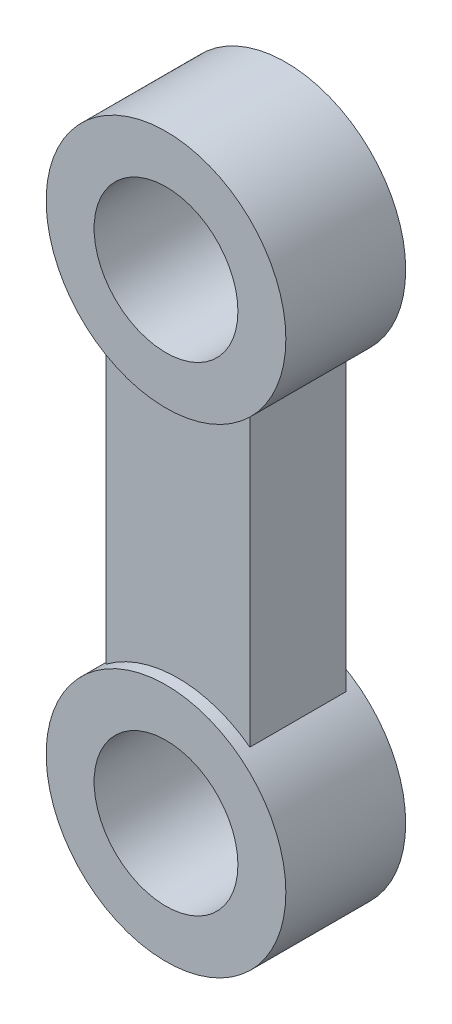
ISO-10303-21;
HEADER;
FILE_DESCRIPTION(('STEP AP214'),'2;1');
FILE_NAME('part.step','',(''),(''),'','','');
FILE_SCHEMA(('AUTOMOTIVE_DESIGN { 1 0 10303 214 1 1 1 1 }'));
ENDSEC;
DATA;
#1=APPLICATION_CONTEXT('core data for automotive mechanical design processes');
#2=APPLICATION_PROTOCOL_DEFINITION('international standard','automotive_design',2000,#1);
#3=PRODUCT_CONTEXT('',#1,'mechanical');
#4=PRODUCT('Part','Part','',(#3));
#5=PRODUCT_RELATED_PRODUCT_CATEGORY('part','',(#4));
#6=PRODUCT_DEFINITION_FORMATION('','',#4);
#7=PRODUCT_DEFINITION_CONTEXT('part definition',#1,'design');
#8=PRODUCT_DEFINITION('design','',#6,#7);
#9=PRODUCT_DEFINITION_SHAPE('','',#8);
#10=(LENGTH_UNIT() NAMED_UNIT(*) SI_UNIT(.MILLI.,.METRE.));
#11=(NAMED_UNIT(*) PLANE_ANGLE_UNIT() SI_UNIT($,.RADIAN.));
#12=(NAMED_UNIT(*) SI_UNIT($,.STERADIAN.) SOLID_ANGLE_UNIT());
#13=UNCERTAINTY_MEASURE_WITH_UNIT(LENGTH_MEASURE(1.E-05),#10,'distance_accuracy_value','');
#14=(GEOMETRIC_REPRESENTATION_CONTEXT(3) GLOBAL_UNCERTAINTY_ASSIGNED_CONTEXT((#13)) GLOBAL_UNIT_ASSIGNED_CONTEXT((#10,
#11,#12)) REPRESENTATION_CONTEXT('',''));
#15=CARTESIAN_POINT('',(0.,0.,0.));
#16=DIRECTION('',(0.,0.,1.));
#17=DIRECTION('',(1.,0.,0.));
#18=AXIS2_PLACEMENT_3D('',#15,#16,#17);
#19=CARTESIAN_POINT('',(-15.,-100.,10.));
#20=DIRECTION('',(-1.,0.,0.));
#21=DIRECTION('',(0.,0.,1.));
#22=AXIS2_PLACEMENT_3D('',#19,#20,#21);
#23=PLANE('',#22);
#24=DIRECTION('',(0.,1.,0.));
#25=VECTOR('',#24,1.);
#26=CARTESIAN_POINT('',(-15.,-100.,-10.));
#27=LINE('',#26,#25);
#28=CARTESIAN_POINT('',(-15.,-80.,-9.99999999999999));
#29=VERTEX_POINT('',#28);
#30=CARTESIAN_POINT('',(-15.,-20.,-9.99999999999999));
#31=VERTEX_POINT('',#30);
#32=EDGE_CURVE('E80',#29,#31,#27,.T.);
#33=ORIENTED_EDGE('',*,*,#32,.F.);
#34=DIRECTION('',(0.,0.,-1.));
#35=VECTOR('',#34,1.);
#36=CARTESIAN_POINT('',(-15.,-80.,12.5));
#37=LINE('',#36,#35);
#38=CARTESIAN_POINT('',(-15.,-80.,10.));
#39=VERTEX_POINT('',#38);
#40=EDGE_CURVE('E73',#29,#39,#37,.F.);
#41=ORIENTED_EDGE('',*,*,#40,.T.);
#42=DIRECTION('',(0.,1.,0.));
#43=VECTOR('',#42,1.);
#44=CARTESIAN_POINT('',(-15.,-100.,10.));
#45=LINE('',#44,#43);
#46=CARTESIAN_POINT('',(-15.,-20.,10.));
#47=VERTEX_POINT('',#46);
#48=EDGE_CURVE('E79',#39,#47,#45,.T.);
#49=ORIENTED_EDGE('',*,*,#48,.T.);
#50=DIRECTION('',(0.,0.,-1.));
#51=VECTOR('',#50,1.);
#52=CARTESIAN_POINT('',(-15.,-20.,12.5));
#53=LINE('',#52,#51);
#54=EDGE_CURVE('E100',#31,#47,#53,.F.);
#55=ORIENTED_EDGE('',*,*,#54,.F.);
#56=EDGE_LOOP('',(#33,#41,#49,#55));
#57=FACE_BOUND('',#56,.T.);
#58=ADVANCED_FACE('F32',(#57),#23,.T.);
#59=CARTESIAN_POINT('',(15.,-100.,10.));
#60=DIRECTION('',(1.,0.,0.));
#61=DIRECTION('',(0.,0.,-1.));
#62=AXIS2_PLACEMENT_3D('',#59,#60,#61);
#63=PLANE('',#62);
#64=DIRECTION('',(0.,1.,0.));
#65=VECTOR('',#64,1.);
#66=CARTESIAN_POINT('',(15.,-100.,10.));
#67=LINE('',#66,#65);
#68=CARTESIAN_POINT('',(15.,-80.,10.));
#69=VERTEX_POINT('',#68);
#70=CARTESIAN_POINT('',(15.,-20.,10.));
#71=VERTEX_POINT('',#70);
#72=EDGE_CURVE('E53',#69,#71,#67,.T.);
#73=ORIENTED_EDGE('',*,*,#72,.F.);
#74=DIRECTION('',(0.,0.,-1.));
#75=VECTOR('',#74,1.);
#76=CARTESIAN_POINT('',(15.,-80.,12.5));
#77=LINE('',#76,#75);
#78=CARTESIAN_POINT('',(15.,-80.,-10.));
#79=VERTEX_POINT('',#78);
#80=EDGE_CURVE('E47',#69,#79,#77,.T.);
#81=ORIENTED_EDGE('',*,*,#80,.T.);
#82=DIRECTION('',(0.,1.,0.));
#83=VECTOR('',#82,1.);
#84=CARTESIAN_POINT('',(15.,-100.,-10.));
#85=LINE('',#84,#83);
#86=CARTESIAN_POINT('',(15.,-20.,-10.));
#87=VERTEX_POINT('',#86);
#88=EDGE_CURVE('E88',#79,#87,#85,.T.);
#89=ORIENTED_EDGE('',*,*,#88,.T.);
#90=DIRECTION('',(0.,0.,-1.));
#91=VECTOR('',#90,1.);
#92=CARTESIAN_POINT('',(15.,-20.,12.5));
#93=LINE('',#92,#91);
#94=EDGE_CURVE('E94',#71,#87,#93,.T.);
#95=ORIENTED_EDGE('',*,*,#94,.F.);
#96=EDGE_LOOP('',(#73,#81,#89,#95));
#97=FACE_BOUND('',#96,.T.);
#98=ADVANCED_FACE('F135',(#97),#63,.T.);
#99=CARTESIAN_POINT('',(0.,0.,12.5));
#100=DIRECTION('',(0.,0.,1.));
#101=DIRECTION('',(1.,0.,0.));
#102=AXIS2_PLACEMENT_3D('',#99,#100,#101);
#103=PLANE('',#102);
#104=CARTESIAN_POINT('',(0.,0.,12.5));
#105=DIRECTION('',(0.,0.,1.));
#106=DIRECTION('',(1.,0.,0.));
#107=AXIS2_PLACEMENT_3D('',#104,#105,#106);
#108=CIRCLE('',#107,25.);
#109=CARTESIAN_POINT('',(25.,0.,12.5));
#110=VERTEX_POINT('',#109);
#111=EDGE_CURVE('E40',#110,#110,#108,.T.);
#112=ORIENTED_EDGE('',*,*,#111,.T.);
#113=EDGE_LOOP('',(#112));
#114=FACE_BOUND('',#113,.T.);
#115=CARTESIAN_POINT('',(0.,0.,12.5));
#116=DIRECTION('',(0.,0.,1.));
#117=DIRECTION('',(1.,0.,0.));
#118=AXIS2_PLACEMENT_3D('',#115,#116,#117);
#119=CIRCLE('',#118,15.);
#120=CARTESIAN_POINT('',(15.,0.,12.5));
#121=VERTEX_POINT('',#120);
#122=EDGE_CURVE('E103',#121,#121,#119,.T.);
#123=ORIENTED_EDGE('',*,*,#122,.F.);
#124=EDGE_LOOP('',(#123));
#125=FACE_BOUND('',#124,.T.);
#126=ADVANCED_FACE('F117',(#114,#125),#103,.T.);
#127=CARTESIAN_POINT('',(0.,0.,-12.5));
#128=DIRECTION('',(0.,0.,1.));
#129=DIRECTION('',(1.,0.,0.));
#130=AXIS2_PLACEMENT_3D('',#127,#128,#129);
#131=PLANE('',#130);
#132=CARTESIAN_POINT('',(0.,0.,-12.5));
#133=DIRECTION('',(0.,0.,1.));
#134=DIRECTION('',(1.,0.,0.));
#135=AXIS2_PLACEMENT_3D('',#132,#133,#134);
#136=CIRCLE('',#135,25.);
#137=CARTESIAN_POINT('',(25.,0.,-12.5));
#138=VERTEX_POINT('',#137);
#139=EDGE_CURVE('E106',#138,#138,#136,.T.);
#140=ORIENTED_EDGE('',*,*,#139,.F.);
#141=EDGE_LOOP('',(#140));
#142=FACE_BOUND('',#141,.T.);
#143=CARTESIAN_POINT('',(0.,0.,-12.5));
#144=DIRECTION('',(0.,0.,1.));
#145=DIRECTION('',(1.,0.,0.));
#146=AXIS2_PLACEMENT_3D('',#143,#144,#145);
#147=CIRCLE('',#146,15.);
#148=CARTESIAN_POINT('',(15.,0.,-12.5));
#149=VERTEX_POINT('',#148);
#150=EDGE_CURVE('E102',#149,#149,#147,.T.);
#151=ORIENTED_EDGE('',*,*,#150,.T.);
#152=EDGE_LOOP('',(#151));
#153=FACE_BOUND('',#152,.T.);
#154=ADVANCED_FACE('F114',(#142,#153),#131,.F.);
#155=CARTESIAN_POINT('',(0.,0.,12.5));
#156=DIRECTION('',(0.,0.,-1.));
#157=DIRECTION('',(-1.,0.,0.));
#158=AXIS2_PLACEMENT_3D('',#155,#156,#157);
#159=CYLINDRICAL_SURFACE('',#158,25.);
#160=CARTESIAN_POINT('',(0.,0.,-9.99999999999999));
#161=DIRECTION('',(0.,0.,-1.));
#162=DIRECTION('',(-1.,0.,0.));
#163=AXIS2_PLACEMENT_3D('',#160,#161,#162);
#164=CIRCLE('',#163,25.);
#165=EDGE_CURVE('E97',#87,#31,#164,.T.);
#166=ORIENTED_EDGE('',*,*,#165,.T.);
#167=ORIENTED_EDGE('',*,*,#54,.T.);
#168=CARTESIAN_POINT('',(0.,0.,10.));
#169=DIRECTION('',(0.,0.,1.));
#170=DIRECTION('',(1.,0.,0.));
#171=AXIS2_PLACEMENT_3D('',#168,#169,#170);
#172=CIRCLE('',#171,25.);
#173=EDGE_CURVE('E85',#47,#71,#172,.T.);
#174=ORIENTED_EDGE('',*,*,#173,.T.);
#175=ORIENTED_EDGE('',*,*,#94,.T.);
#176=EDGE_LOOP('',(#166,#167,#174,#175));
#177=FACE_BOUND('',#176,.T.);
#178=ORIENTED_EDGE('',*,*,#111,.F.);
#179=EDGE_LOOP('',(#178));
#180=FACE_BOUND('',#179,.T.);
#181=ORIENTED_EDGE('',*,*,#139,.T.);
#182=EDGE_LOOP('',(#181));
#183=FACE_BOUND('',#182,.T.);
#184=ADVANCED_FACE('F34',(#177,#180,#183),#159,.T.);
#185=CARTESIAN_POINT('',(0.,0.,12.5));
#186=DIRECTION('',(0.,0.,-1.));
#187=DIRECTION('',(-1.,0.,0.));
#188=AXIS2_PLACEMENT_3D('',#185,#186,#187);
#189=CYLINDRICAL_SURFACE('',#188,15.);
#190=ORIENTED_EDGE('',*,*,#122,.T.);
#191=EDGE_LOOP('',(#190));
#192=FACE_BOUND('',#191,.T.);
#193=ORIENTED_EDGE('',*,*,#150,.F.);
#194=EDGE_LOOP('',(#193));
#195=FACE_BOUND('',#194,.T.);
#196=ADVANCED_FACE('F120',(#192,#195),#189,.F.);
#197=CARTESIAN_POINT('',(15.,-100.,-10.));
#198=DIRECTION('',(0.,0.,-1.));
#199=DIRECTION('',(-1.,0.,0.));
#200=AXIS2_PLACEMENT_3D('',#197,#198,#199);
#201=PLANE('',#200);
#202=ORIENTED_EDGE('',*,*,#88,.F.);
#203=CARTESIAN_POINT('',(0.,-100.,-9.99999999999999));
#204=DIRECTION('',(0.,0.,-1.));
#205=DIRECTION('',(-1.,0.,0.));
#206=AXIS2_PLACEMENT_3D('',#203,#204,#205);
#207=CIRCLE('',#206,25.);
#208=EDGE_CURVE('E81',#79,#29,#207,.F.);
#209=ORIENTED_EDGE('',*,*,#208,.T.);
#210=ORIENTED_EDGE('',*,*,#32,.T.);
#211=ORIENTED_EDGE('',*,*,#165,.F.);
#212=EDGE_LOOP('',(#202,#209,#210,#211));
#213=FACE_BOUND('',#212,.T.);
#214=ADVANCED_FACE('F122',(#213),#201,.T.);
#215=CARTESIAN_POINT('',(15.,-100.,10.));
#216=DIRECTION('',(0.,0.,1.));
#217=DIRECTION('',(1.,0.,0.));
#218=AXIS2_PLACEMENT_3D('',#215,#216,#217);
#219=PLANE('',#218);
#220=ORIENTED_EDGE('',*,*,#48,.F.);
#221=CARTESIAN_POINT('',(0.,-100.,10.));
#222=DIRECTION('',(0.,0.,1.));
#223=DIRECTION('',(1.,0.,0.));
#224=AXIS2_PLACEMENT_3D('',#221,#222,#223);
#225=CIRCLE('',#224,25.);
#226=EDGE_CURVE('E11',#39,#69,#225,.F.);
#227=ORIENTED_EDGE('',*,*,#226,.T.);
#228=ORIENTED_EDGE('',*,*,#72,.T.);
#229=ORIENTED_EDGE('',*,*,#173,.F.);
#230=EDGE_LOOP('',(#220,#227,#228,#229));
#231=FACE_BOUND('',#230,.T.);
#232=ADVANCED_FACE('F83',(#231),#219,.T.);
#233=CARTESIAN_POINT('',(0.,-100.,12.5));
#234=DIRECTION('',(0.,0.,-1.));
#235=DIRECTION('',(-1.,0.,0.));
#236=AXIS2_PLACEMENT_3D('',#233,#234,#235);
#237=CYLINDRICAL_SURFACE('',#236,15.);
#238=CARTESIAN_POINT('',(0.,-100.,-12.5));
#239=DIRECTION('',(0.,0.,1.));
#240=DIRECTION('',(1.,0.,0.));
#241=AXIS2_PLACEMENT_3D('',#238,#239,#240);
#242=CIRCLE('',#241,15.);
#243=CARTESIAN_POINT('',(15.,-100.,-12.5));
#244=VERTEX_POINT('',#243);
#245=EDGE_CURVE('E162',#244,#244,#242,.T.);
#246=ORIENTED_EDGE('',*,*,#245,.F.);
#247=EDGE_LOOP('',(#246));
#248=FACE_BOUND('',#247,.T.);
#249=CARTESIAN_POINT('',(0.,-100.,12.5));
#250=DIRECTION('',(0.,0.,1.));
#251=DIRECTION('',(1.,0.,0.));
#252=AXIS2_PLACEMENT_3D('',#249,#250,#251);
#253=CIRCLE('',#252,15.);
#254=CARTESIAN_POINT('',(15.,-100.,12.5));
#255=VERTEX_POINT('',#254);
#256=EDGE_CURVE('E165',#255,#255,#253,.T.);
#257=ORIENTED_EDGE('',*,*,#256,.T.);
#258=EDGE_LOOP('',(#257));
#259=FACE_BOUND('',#258,.T.);
#260=ADVANCED_FACE('F143',(#248,#259),#237,.F.);
#261=CARTESIAN_POINT('',(0.,-100.,12.5));
#262=DIRECTION('',(0.,0.,1.));
#263=DIRECTION('',(1.,0.,0.));
#264=AXIS2_PLACEMENT_3D('',#261,#262,#263);
#265=PLANE('',#264);
#266=CARTESIAN_POINT('',(0.,-100.,12.5));
#267=DIRECTION('',(0.,0.,1.));
#268=DIRECTION('',(1.,0.,0.));
#269=AXIS2_PLACEMENT_3D('',#266,#267,#268);
#270=CIRCLE('',#269,25.);
#271=CARTESIAN_POINT('',(25.,-100.,12.5));
#272=VERTEX_POINT('',#271);
#273=EDGE_CURVE('E170',#272,#272,#270,.T.);
#274=ORIENTED_EDGE('',*,*,#273,.T.);
#275=EDGE_LOOP('',(#274));
#276=FACE_BOUND('',#275,.T.);
#277=ORIENTED_EDGE('',*,*,#256,.F.);
#278=EDGE_LOOP('',(#277));
#279=FACE_BOUND('',#278,.T.);
#280=ADVANCED_FACE('F150',(#276,#279),#265,.T.);
#281=CARTESIAN_POINT('',(0.,-100.,-12.5));
#282=DIRECTION('',(0.,0.,1.));
#283=DIRECTION('',(1.,0.,0.));
#284=AXIS2_PLACEMENT_3D('',#281,#282,#283);
#285=PLANE('',#284);
#286=CARTESIAN_POINT('',(0.,-100.,-12.5));
#287=DIRECTION('',(0.,0.,1.));
#288=DIRECTION('',(1.,0.,0.));
#289=AXIS2_PLACEMENT_3D('',#286,#287,#288);
#290=CIRCLE('',#289,25.);
#291=CARTESIAN_POINT('',(25.,-100.,-12.5));
#292=VERTEX_POINT('',#291);
#293=EDGE_CURVE('E167',#292,#292,#290,.T.);
#294=ORIENTED_EDGE('',*,*,#293,.F.);
#295=EDGE_LOOP('',(#294));
#296=FACE_BOUND('',#295,.T.);
#297=ORIENTED_EDGE('',*,*,#245,.T.);
#298=EDGE_LOOP('',(#297));
#299=FACE_BOUND('',#298,.T.);
#300=ADVANCED_FACE('F147',(#296,#299),#285,.F.);
#301=CARTESIAN_POINT('',(0.,-100.,12.5));
#302=DIRECTION('',(0.,0.,-1.));
#303=DIRECTION('',(-1.,0.,0.));
#304=AXIS2_PLACEMENT_3D('',#301,#302,#303);
#305=CYLINDRICAL_SURFACE('',#304,25.);
#306=ORIENTED_EDGE('',*,*,#208,.F.);
#307=ORIENTED_EDGE('',*,*,#80,.F.);
#308=ORIENTED_EDGE('',*,*,#226,.F.);
#309=ORIENTED_EDGE('',*,*,#40,.F.);
#310=EDGE_LOOP('',(#306,#307,#308,#309));
#311=FACE_BOUND('',#310,.T.);
#312=ORIENTED_EDGE('',*,*,#273,.F.);
#313=EDGE_LOOP('',(#312));
#314=FACE_BOUND('',#313,.T.);
#315=ORIENTED_EDGE('',*,*,#293,.T.);
#316=EDGE_LOOP('',(#315));
#317=FACE_BOUND('',#316,.T.);
#318=ADVANCED_FACE('F71',(#311,#314,#317),#305,.T.);
#319=CLOSED_SHELL('',(#58,#98,#126,#154,#184,#196,#214,#232,#260,#280,#300,#318));
#320=MANIFOLD_SOLID_BREP('B2',#319);
#321=ADVANCED_BREP_SHAPE_REPRESENTATION('',(#18,#320),#14);
#322=SHAPE_DEFINITION_REPRESENTATION(#9,#321);
ENDSEC;
END-ISO-10303-21;
